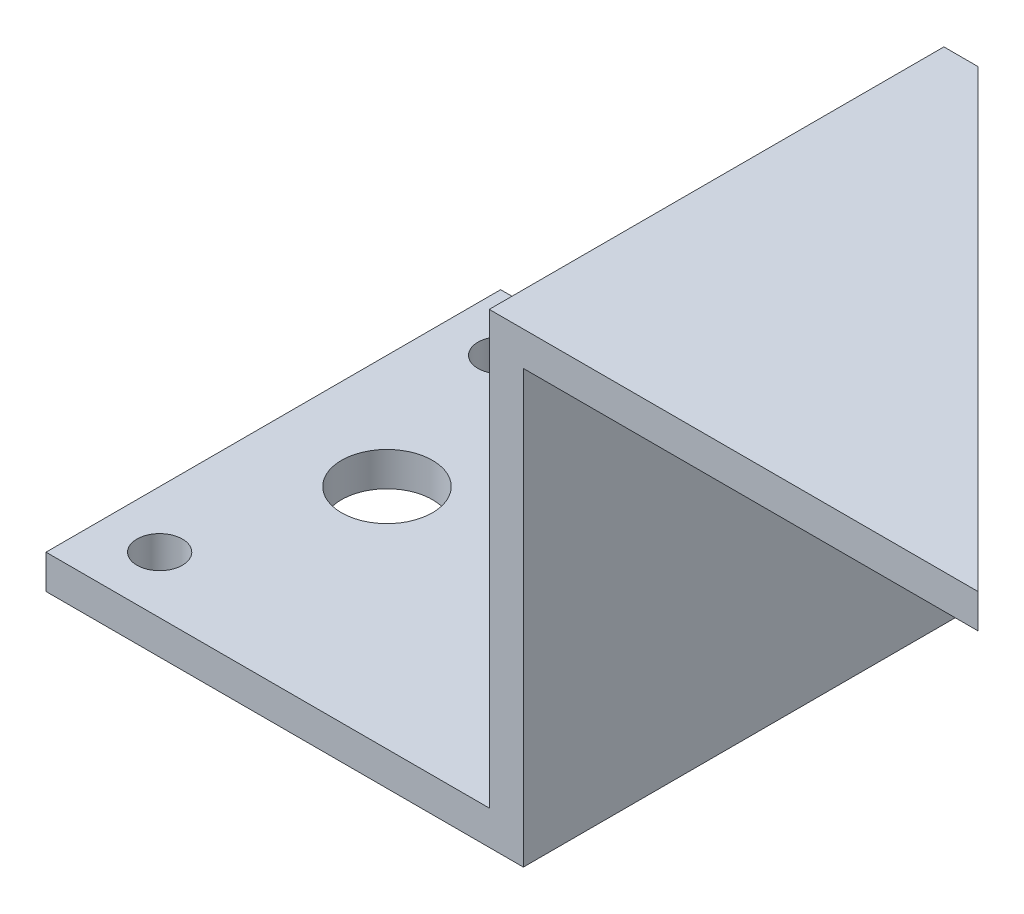
ISO-10303-21;
HEADER;
FILE_DESCRIPTION(('STEP AP214'),'2;1');
FILE_NAME('part.step','',(''),(''),'','','');
FILE_SCHEMA(('AUTOMOTIVE_DESIGN { 1 0 10303 214 1 1 1 1 }'));
ENDSEC;
DATA;
#1=APPLICATION_CONTEXT('core data for automotive mechanical design processes');
#2=APPLICATION_PROTOCOL_DEFINITION('international standard','automotive_design',2000,#1);
#3=PRODUCT_CONTEXT('',#1,'mechanical');
#4=PRODUCT('Part','Part','',(#3));
#5=PRODUCT_RELATED_PRODUCT_CATEGORY('part','',(#4));
#6=PRODUCT_DEFINITION_FORMATION('','',#4);
#7=PRODUCT_DEFINITION_CONTEXT('part definition',#1,'design');
#8=PRODUCT_DEFINITION('design','',#6,#7);
#9=PRODUCT_DEFINITION_SHAPE('','',#8);
#10=(LENGTH_UNIT() NAMED_UNIT(*) SI_UNIT(.MILLI.,.METRE.));
#11=(NAMED_UNIT(*) PLANE_ANGLE_UNIT() SI_UNIT($,.RADIAN.));
#12=(NAMED_UNIT(*) SI_UNIT($,.STERADIAN.) SOLID_ANGLE_UNIT());
#13=UNCERTAINTY_MEASURE_WITH_UNIT(LENGTH_MEASURE(1.E-05),#10,'distance_accuracy_value','');
#14=(GEOMETRIC_REPRESENTATION_CONTEXT(3) GLOBAL_UNCERTAINTY_ASSIGNED_CONTEXT((#13)) GLOBAL_UNIT_ASSIGNED_CONTEXT((#10,
#11,#12)) REPRESENTATION_CONTEXT('',''));
#15=CARTESIAN_POINT('',(0.,0.,0.));
#16=DIRECTION('',(0.,0.,1.));
#17=DIRECTION('',(1.,0.,0.));
#18=AXIS2_PLACEMENT_3D('',#15,#16,#17);
#19=CARTESIAN_POINT('',(21.,3.,-20.));
#20=DIRECTION('',(-1.,0.,0.));
#21=DIRECTION('',(0.,0.,1.));
#22=AXIS2_PLACEMENT_3D('',#19,#20,#21);
#23=PLANE('',#22);
#24=DIRECTION('',(0.,0.,-1.));
#25=VECTOR('',#24,1.);
#26=CARTESIAN_POINT('',(21.,38.,20.));
#27=LINE('',#26,#25);
#28=CARTESIAN_POINT('',(21.,38.,20.));
#29=VERTEX_POINT('',#28);
#30=CARTESIAN_POINT('',(21.,38.,-20.));
#31=VERTEX_POINT('',#30);
#32=EDGE_CURVE('E47',#29,#31,#27,.T.);
#33=ORIENTED_EDGE('',*,*,#32,.F.);
#34=DIRECTION('',(0.,-1.,0.));
#35=VECTOR('',#34,1.);
#36=CARTESIAN_POINT('',(21.,3.,20.));
#37=LINE('',#36,#35);
#38=CARTESIAN_POINT('',(21.,0.,20.));
#39=VERTEX_POINT('',#38);
#40=EDGE_CURVE('E154',#29,#39,#37,.T.);
#41=ORIENTED_EDGE('',*,*,#40,.T.);
#42=DIRECTION('',(0.,0.,-1.));
#43=VECTOR('',#42,1.);
#44=CARTESIAN_POINT('',(21.,0.,-20.));
#45=LINE('',#44,#43);
#46=CARTESIAN_POINT('',(21.,0.,-20.));
#47=VERTEX_POINT('',#46);
#48=EDGE_CURVE('E144',#39,#47,#45,.T.);
#49=ORIENTED_EDGE('',*,*,#48,.T.);
#50=DIRECTION('',(0.,-1.,0.));
#51=VECTOR('',#50,1.);
#52=CARTESIAN_POINT('',(21.,3.,-20.));
#53=LINE('',#52,#51);
#54=EDGE_CURVE('E11',#31,#47,#53,.T.);
#55=ORIENTED_EDGE('',*,*,#54,.F.);
#56=EDGE_LOOP('',(#33,#41,#49,#55));
#57=FACE_BOUND('',#56,.T.);
#58=ADVANCED_FACE('F33',(#57),#23,.F.);
#59=CARTESIAN_POINT('',(0.,3.,0.));
#60=DIRECTION('',(0.,1.,0.));
#61=DIRECTION('',(0.,0.,1.));
#62=AXIS2_PLACEMENT_3D('',#59,#60,#61);
#63=PLANE('',#62);
#64=DIRECTION('',(0.,0.,1.));
#65=VECTOR('',#64,1.);
#66=CARTESIAN_POINT('',(18.,3.,-20.));
#67=LINE('',#66,#65);
#68=CARTESIAN_POINT('',(18.,3.,-20.));
#69=VERTEX_POINT('',#68);
#70=CARTESIAN_POINT('',(18.,3.,20.));
#71=VERTEX_POINT('',#70);
#72=EDGE_CURVE('E55',#69,#71,#67,.T.);
#73=ORIENTED_EDGE('',*,*,#72,.F.);
#74=DIRECTION('',(-1.,0.,0.));
#75=VECTOR('',#74,1.);
#76=CARTESIAN_POINT('',(-21.,3.,-20.));
#77=LINE('',#76,#75);
#78=CARTESIAN_POINT('',(-21.,3.,-20.));
#79=VERTEX_POINT('',#78);
#80=EDGE_CURVE('E147',#69,#79,#77,.T.);
#81=ORIENTED_EDGE('',*,*,#80,.T.);
#82=DIRECTION('',(0.,0.,1.));
#83=VECTOR('',#82,1.);
#84=CARTESIAN_POINT('',(-21.,3.,-20.));
#85=LINE('',#84,#83);
#86=CARTESIAN_POINT('',(-21.,3.,20.));
#87=VERTEX_POINT('',#86);
#88=EDGE_CURVE('E149',#79,#87,#85,.T.);
#89=ORIENTED_EDGE('',*,*,#88,.T.);
#90=DIRECTION('',(1.,0.,0.));
#91=VECTOR('',#90,1.);
#92=CARTESIAN_POINT('',(-21.,3.,20.));
#93=LINE('',#92,#91);
#94=EDGE_CURVE('E152',#87,#71,#93,.T.);
#95=ORIENTED_EDGE('',*,*,#94,.T.);
#96=EDGE_LOOP('',(#73,#81,#89,#95));
#97=FACE_BOUND('',#96,.T.);
#98=CARTESIAN_POINT('',(-16.,3.,15.));
#99=DIRECTION('',(0.,1.,0.));
#100=DIRECTION('',(0.,0.,1.));
#101=AXIS2_PLACEMENT_3D('',#98,#99,#100);
#102=CIRCLE('',#101,2.);
#103=CARTESIAN_POINT('',(-16.,3.,17.));
#104=VERTEX_POINT('',#103);
#105=EDGE_CURVE('E135',#104,#104,#102,.T.);
#106=ORIENTED_EDGE('',*,*,#105,.F.);
#107=EDGE_LOOP('',(#106));
#108=FACE_BOUND('',#107,.T.);
#109=CARTESIAN_POINT('',(-16.,3.,-15.));
#110=DIRECTION('',(0.,1.,0.));
#111=DIRECTION('',(0.,0.,1.));
#112=AXIS2_PLACEMENT_3D('',#109,#110,#111);
#113=CIRCLE('',#112,2.);
#114=CARTESIAN_POINT('',(-16.,3.,-13.));
#115=VERTEX_POINT('',#114);
#116=EDGE_CURVE('E141',#115,#115,#113,.T.);
#117=ORIENTED_EDGE('',*,*,#116,.F.);
#118=EDGE_LOOP('',(#117));
#119=FACE_BOUND('',#118,.T.);
#120=CARTESIAN_POINT('',(-11.,3.,0.));
#121=DIRECTION('',(0.,1.,0.));
#122=DIRECTION('',(0.,0.,1.));
#123=AXIS2_PLACEMENT_3D('',#120,#121,#122);
#124=CIRCLE('',#123,4.);
#125=CARTESIAN_POINT('',(-11.,3.,4.));
#126=VERTEX_POINT('',#125);
#127=EDGE_CURVE('E129',#126,#126,#124,.T.);
#128=ORIENTED_EDGE('',*,*,#127,.F.);
#129=EDGE_LOOP('',(#128));
#130=FACE_BOUND('',#129,.T.);
#131=ADVANCED_FACE('F185',(#97,#108,#119,#130),#63,.T.);
#132=CARTESIAN_POINT('',(0.,0.,0.));
#133=DIRECTION('',(0.,1.,0.));
#134=DIRECTION('',(0.,0.,1.));
#135=AXIS2_PLACEMENT_3D('',#132,#133,#134);
#136=PLANE('',#135);
#137=ORIENTED_EDGE('',*,*,#48,.F.);
#138=DIRECTION('',(1.,0.,0.));
#139=VECTOR('',#138,1.);
#140=CARTESIAN_POINT('',(-21.,0.,20.));
#141=LINE('',#140,#139);
#142=CARTESIAN_POINT('',(-21.,0.,20.));
#143=VERTEX_POINT('',#142);
#144=EDGE_CURVE('E150',#143,#39,#141,.T.);
#145=ORIENTED_EDGE('',*,*,#144,.F.);
#146=DIRECTION('',(0.,0.,1.));
#147=VECTOR('',#146,1.);
#148=CARTESIAN_POINT('',(-21.,0.,-20.));
#149=LINE('',#148,#147);
#150=CARTESIAN_POINT('',(-21.,0.,-20.));
#151=VERTEX_POINT('',#150);
#152=EDGE_CURVE('E159',#151,#143,#149,.T.);
#153=ORIENTED_EDGE('',*,*,#152,.F.);
#154=DIRECTION('',(-1.,0.,0.));
#155=VECTOR('',#154,1.);
#156=CARTESIAN_POINT('',(-21.,0.,-20.));
#157=LINE('',#156,#155);
#158=EDGE_CURVE('E157',#47,#151,#157,.T.);
#159=ORIENTED_EDGE('',*,*,#158,.F.);
#160=EDGE_LOOP('',(#137,#145,#153,#159));
#161=FACE_BOUND('',#160,.T.);
#162=CARTESIAN_POINT('',(-16.,0.,-15.));
#163=DIRECTION('',(0.,1.,0.));
#164=DIRECTION('',(0.,0.,1.));
#165=AXIS2_PLACEMENT_3D('',#162,#163,#164);
#166=CIRCLE('',#165,2.);
#167=CARTESIAN_POINT('',(-16.,0.,-13.));
#168=VERTEX_POINT('',#167);
#169=EDGE_CURVE('E138',#168,#168,#166,.T.);
#170=ORIENTED_EDGE('',*,*,#169,.T.);
#171=EDGE_LOOP('',(#170));
#172=FACE_BOUND('',#171,.T.);
#173=CARTESIAN_POINT('',(-16.,0.,15.));
#174=DIRECTION('',(0.,1.,0.));
#175=DIRECTION('',(0.,0.,1.));
#176=AXIS2_PLACEMENT_3D('',#173,#174,#175);
#177=CIRCLE('',#176,2.);
#178=CARTESIAN_POINT('',(-16.,0.,17.));
#179=VERTEX_POINT('',#178);
#180=EDGE_CURVE('E132',#179,#179,#177,.T.);
#181=ORIENTED_EDGE('',*,*,#180,.T.);
#182=EDGE_LOOP('',(#181));
#183=FACE_BOUND('',#182,.T.);
#184=CARTESIAN_POINT('',(-11.,0.,0.));
#185=DIRECTION('',(0.,1.,0.));
#186=DIRECTION('',(0.,0.,1.));
#187=AXIS2_PLACEMENT_3D('',#184,#185,#186);
#188=CIRCLE('',#187,4.);
#189=CARTESIAN_POINT('',(-11.,0.,4.));
#190=VERTEX_POINT('',#189);
#191=EDGE_CURVE('E128',#190,#190,#188,.T.);
#192=ORIENTED_EDGE('',*,*,#191,.T.);
#193=EDGE_LOOP('',(#192));
#194=FACE_BOUND('',#193,.T.);
#195=ADVANCED_FACE('F177',(#161,#172,#183,#194),#136,.F.);
#196=CARTESIAN_POINT('',(-21.,3.,-20.));
#197=DIRECTION('',(0.,0.,1.));
#198=DIRECTION('',(1.,0.,0.));
#199=AXIS2_PLACEMENT_3D('',#196,#197,#198);
#200=PLANE('',#199);
#201=DIRECTION('',(-1.,0.,0.));
#202=VECTOR('',#201,1.);
#203=CARTESIAN_POINT('',(21.,41.,-20.));
#204=LINE('',#203,#202);
#205=CARTESIAN_POINT('',(21.,41.,-20.));
#206=VERTEX_POINT('',#205);
#207=CARTESIAN_POINT('',(18.,41.,-20.));
#208=VERTEX_POINT('',#207);
#209=EDGE_CURVE('E105',#206,#208,#204,.T.);
#210=ORIENTED_EDGE('',*,*,#209,.F.);
#211=DIRECTION('',(0.,-1.,0.));
#212=VECTOR('',#211,1.);
#213=CARTESIAN_POINT('',(21.,41.,-20.));
#214=LINE('',#213,#212);
#215=EDGE_CURVE('E93',#206,#31,#214,.T.);
#216=ORIENTED_EDGE('',*,*,#215,.T.);
#217=ORIENTED_EDGE('',*,*,#54,.T.);
#218=ORIENTED_EDGE('',*,*,#158,.T.);
#219=DIRECTION('',(0.,-1.,0.));
#220=VECTOR('',#219,1.);
#221=CARTESIAN_POINT('',(-21.,3.,-20.));
#222=LINE('',#221,#220);
#223=EDGE_CURVE('E40',#79,#151,#222,.T.);
#224=ORIENTED_EDGE('',*,*,#223,.F.);
#225=ORIENTED_EDGE('',*,*,#80,.F.);
#226=DIRECTION('',(0.,-1.,0.));
#227=VECTOR('',#226,1.);
#228=CARTESIAN_POINT('',(18.,41.,-20.));
#229=LINE('',#228,#227);
#230=EDGE_CURVE('E113',#208,#69,#229,.T.);
#231=ORIENTED_EDGE('',*,*,#230,.F.);
#232=EDGE_LOOP('',(#210,#216,#217,#218,#224,#225,#231));
#233=FACE_BOUND('',#232,.T.);
#234=ADVANCED_FACE('F111',(#233),#200,.F.);
#235=CARTESIAN_POINT('',(-21.,3.,-20.));
#236=DIRECTION('',(1.,0.,0.));
#237=DIRECTION('',(0.,0.,-1.));
#238=AXIS2_PLACEMENT_3D('',#235,#236,#237);
#239=PLANE('',#238);
#240=ORIENTED_EDGE('',*,*,#152,.T.);
#241=DIRECTION('',(0.,-1.,0.));
#242=VECTOR('',#241,1.);
#243=CARTESIAN_POINT('',(-21.,3.,20.));
#244=LINE('',#243,#242);
#245=EDGE_CURVE('E164',#87,#143,#244,.T.);
#246=ORIENTED_EDGE('',*,*,#245,.F.);
#247=ORIENTED_EDGE('',*,*,#88,.F.);
#248=ORIENTED_EDGE('',*,*,#223,.T.);
#249=EDGE_LOOP('',(#240,#246,#247,#248));
#250=FACE_BOUND('',#249,.T.);
#251=ADVANCED_FACE('F171',(#250),#239,.F.);
#252=CARTESIAN_POINT('',(-21.,3.,20.));
#253=DIRECTION('',(0.,0.,-1.));
#254=DIRECTION('',(-1.,0.,0.));
#255=AXIS2_PLACEMENT_3D('',#252,#253,#254);
#256=PLANE('',#255);
#257=ORIENTED_EDGE('',*,*,#144,.T.);
#258=ORIENTED_EDGE('',*,*,#40,.F.);
#259=DIRECTION('',(-1.,0.,0.));
#260=VECTOR('',#259,1.);
#261=CARTESIAN_POINT('',(61.,38.,20.));
#262=LINE('',#261,#260);
#263=CARTESIAN_POINT('',(61.,38.,20.));
#264=VERTEX_POINT('',#263);
#265=EDGE_CURVE('E118',#264,#29,#262,.T.);
#266=ORIENTED_EDGE('',*,*,#265,.F.);
#267=DIRECTION('',(0.,-1.,0.));
#268=VECTOR('',#267,1.);
#269=CARTESIAN_POINT('',(61.,41.,20.));
#270=LINE('',#269,#268);
#271=CARTESIAN_POINT('',(61.,41.,20.));
#272=VERTEX_POINT('',#271);
#273=EDGE_CURVE('E189',#272,#264,#270,.T.);
#274=ORIENTED_EDGE('',*,*,#273,.F.);
#275=DIRECTION('',(1.,0.,0.));
#276=VECTOR('',#275,1.);
#277=CARTESIAN_POINT('',(21.,41.,20.));
#278=LINE('',#277,#276);
#279=CARTESIAN_POINT('',(18.,41.,20.));
#280=VERTEX_POINT('',#279);
#281=EDGE_CURVE('E108',#280,#272,#278,.T.);
#282=ORIENTED_EDGE('',*,*,#281,.F.);
#283=DIRECTION('',(0.,-1.,0.));
#284=VECTOR('',#283,1.);
#285=CARTESIAN_POINT('',(18.,41.,20.));
#286=LINE('',#285,#284);
#287=EDGE_CURVE('E123',#280,#71,#286,.T.);
#288=ORIENTED_EDGE('',*,*,#287,.T.);
#289=ORIENTED_EDGE('',*,*,#94,.F.);
#290=ORIENTED_EDGE('',*,*,#245,.T.);
#291=EDGE_LOOP('',(#257,#258,#266,#274,#282,#288,#289,#290));
#292=FACE_BOUND('',#291,.T.);
#293=ADVANCED_FACE('F180',(#292),#256,.F.);
#294=CARTESIAN_POINT('',(-16.,3.,-15.));
#295=DIRECTION('',(0.,-1.,0.));
#296=DIRECTION('',(0.,0.,-1.));
#297=AXIS2_PLACEMENT_3D('',#294,#295,#296);
#298=CYLINDRICAL_SURFACE('',#297,2.);
#299=ORIENTED_EDGE('',*,*,#116,.T.);
#300=EDGE_LOOP('',(#299));
#301=FACE_BOUND('',#300,.T.);
#302=ORIENTED_EDGE('',*,*,#169,.F.);
#303=EDGE_LOOP('',(#302));
#304=FACE_BOUND('',#303,.T.);
#305=ADVANCED_FACE('F212',(#301,#304),#298,.F.);
#306=CARTESIAN_POINT('',(-16.,3.,15.));
#307=DIRECTION('',(0.,-1.,0.));
#308=DIRECTION('',(0.,0.,-1.));
#309=AXIS2_PLACEMENT_3D('',#306,#307,#308);
#310=CYLINDRICAL_SURFACE('',#309,2.);
#311=ORIENTED_EDGE('',*,*,#105,.T.);
#312=EDGE_LOOP('',(#311));
#313=FACE_BOUND('',#312,.T.);
#314=ORIENTED_EDGE('',*,*,#180,.F.);
#315=EDGE_LOOP('',(#314));
#316=FACE_BOUND('',#315,.T.);
#317=ADVANCED_FACE('F238',(#313,#316),#310,.F.);
#318=CARTESIAN_POINT('',(-11.,3.,0.));
#319=DIRECTION('',(0.,-1.,0.));
#320=DIRECTION('',(0.,0.,-1.));
#321=AXIS2_PLACEMENT_3D('',#318,#319,#320);
#322=CYLINDRICAL_SURFACE('',#321,4.);
#323=ORIENTED_EDGE('',*,*,#127,.T.);
#324=EDGE_LOOP('',(#323));
#325=FACE_BOUND('',#324,.T.);
#326=ORIENTED_EDGE('',*,*,#191,.F.);
#327=EDGE_LOOP('',(#326));
#328=FACE_BOUND('',#327,.T.);
#329=ADVANCED_FACE('F245',(#325,#328),#322,.F.);
#330=CARTESIAN_POINT('',(18.,41.,-20.));
#331=DIRECTION('',(1.,0.,0.));
#332=DIRECTION('',(0.,0.,-1.));
#333=AXIS2_PLACEMENT_3D('',#330,#331,#332);
#334=PLANE('',#333);
#335=ORIENTED_EDGE('',*,*,#72,.T.);
#336=ORIENTED_EDGE('',*,*,#287,.F.);
#337=DIRECTION('',(0.,0.,1.));
#338=VECTOR('',#337,1.);
#339=CARTESIAN_POINT('',(18.,41.,-20.));
#340=LINE('',#339,#338);
#341=EDGE_CURVE('E115',#208,#280,#340,.T.);
#342=ORIENTED_EDGE('',*,*,#341,.F.);
#343=ORIENTED_EDGE('',*,*,#230,.T.);
#344=EDGE_LOOP('',(#335,#336,#342,#343));
#345=FACE_BOUND('',#344,.T.);
#346=ADVANCED_FACE('F188',(#345),#334,.F.);
#347=CARTESIAN_POINT('',(0.,41.,0.));
#348=DIRECTION('',(0.,-1.,0.));
#349=DIRECTION('',(0.,0.,-1.));
#350=AXIS2_PLACEMENT_3D('',#347,#348,#349);
#351=PLANE('',#350);
#352=ORIENTED_EDGE('',*,*,#281,.T.);
#353=DIRECTION('',(-0.707106781186548,0.,-0.707106781186547));
#354=VECTOR('',#353,1.);
#355=CARTESIAN_POINT('',(21.,41.,-20.));
#356=LINE('',#355,#354);
#357=EDGE_CURVE('E96',#272,#206,#356,.T.);
#358=ORIENTED_EDGE('',*,*,#357,.T.);
#359=ORIENTED_EDGE('',*,*,#209,.T.);
#360=ORIENTED_EDGE('',*,*,#341,.T.);
#361=EDGE_LOOP('',(#352,#358,#359,#360));
#362=FACE_BOUND('',#361,.T.);
#363=ADVANCED_FACE('F104',(#362),#351,.F.);
#364=CARTESIAN_POINT('',(61.,38.,20.));
#365=DIRECTION('',(0.,1.,0.));
#366=DIRECTION('',(0.,0.,1.));
#367=AXIS2_PLACEMENT_3D('',#364,#365,#366);
#368=PLANE('',#367);
#369=ORIENTED_EDGE('',*,*,#32,.T.);
#370=DIRECTION('',(-0.707106781186548,0.,-0.707106781186547));
#371=VECTOR('',#370,1.);
#372=CARTESIAN_POINT('',(21.,38.,-20.));
#373=LINE('',#372,#371);
#374=EDGE_CURVE('E99',#264,#31,#373,.T.);
#375=ORIENTED_EDGE('',*,*,#374,.F.);
#376=ORIENTED_EDGE('',*,*,#265,.T.);
#377=EDGE_LOOP('',(#369,#375,#376));
#378=FACE_BOUND('',#377,.T.);
#379=ADVANCED_FACE('F193',(#378),#368,.F.);
#380=CARTESIAN_POINT('',(21.,41.,-20.));
#381=DIRECTION('',(-0.707106781186547,0.,0.707106781186548));
#382=DIRECTION('',(0.707106781186548,0.,0.707106781186547));
#383=AXIS2_PLACEMENT_3D('',#380,#381,#382);
#384=PLANE('',#383);
#385=ORIENTED_EDGE('',*,*,#374,.T.);
#386=ORIENTED_EDGE('',*,*,#215,.F.);
#387=ORIENTED_EDGE('',*,*,#357,.F.);
#388=ORIENTED_EDGE('',*,*,#273,.T.);
#389=EDGE_LOOP('',(#385,#386,#387,#388));
#390=FACE_BOUND('',#389,.T.);
#391=ADVANCED_FACE('F95',(#390),#384,.F.);
#392=CLOSED_SHELL('',(#58,#131,#195,#234,#251,#293,#305,#317,#329,#346,#363,#379,#391));
#393=MANIFOLD_SOLID_BREP('B2',#392);
#394=ADVANCED_BREP_SHAPE_REPRESENTATION('',(#18,#393),#14);
#395=SHAPE_DEFINITION_REPRESENTATION(#9,#394);
ENDSEC;
END-ISO-10303-21;
